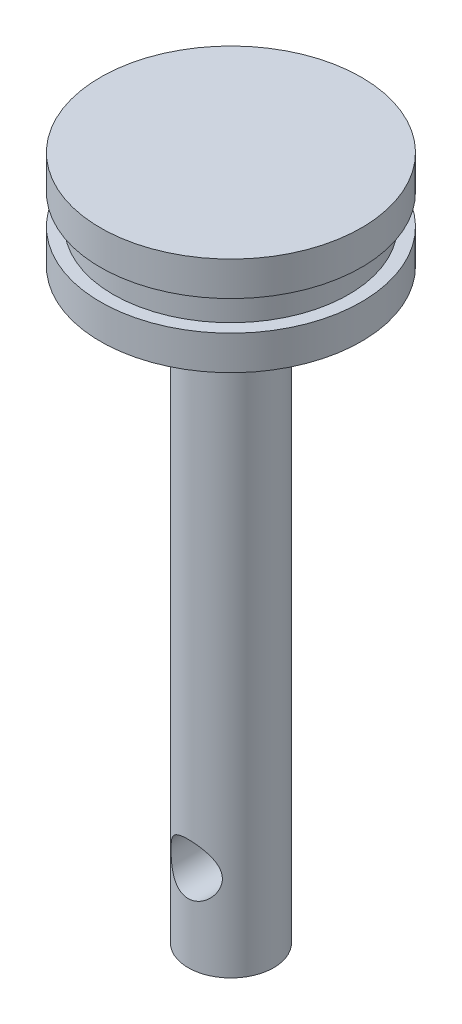
ISO-10303-21;
HEADER;
FILE_DESCRIPTION(('STEP AP214'),'2;1');
FILE_NAME('part.step','',(''),(''),'','','');
FILE_SCHEMA(('AUTOMOTIVE_DESIGN { 1 0 10303 214 1 1 1 1 }'));
ENDSEC;
DATA;
#1=APPLICATION_CONTEXT('core data for automotive mechanical design processes');
#2=APPLICATION_PROTOCOL_DEFINITION('international standard','automotive_design',2000,#1);
#3=PRODUCT_CONTEXT('',#1,'mechanical');
#4=PRODUCT('Part','Part','',(#3));
#5=PRODUCT_RELATED_PRODUCT_CATEGORY('part','',(#4));
#6=PRODUCT_DEFINITION_FORMATION('','',#4);
#7=PRODUCT_DEFINITION_CONTEXT('part definition',#1,'design');
#8=PRODUCT_DEFINITION('design','',#6,#7);
#9=PRODUCT_DEFINITION_SHAPE('','',#8);
#10=(LENGTH_UNIT() NAMED_UNIT(*) SI_UNIT(.MILLI.,.METRE.));
#11=(NAMED_UNIT(*) PLANE_ANGLE_UNIT() SI_UNIT($,.RADIAN.));
#12=(NAMED_UNIT(*) SI_UNIT($,.STERADIAN.) SOLID_ANGLE_UNIT());
#13=UNCERTAINTY_MEASURE_WITH_UNIT(LENGTH_MEASURE(1.E-05),#10,'distance_accuracy_value','');
#14=(GEOMETRIC_REPRESENTATION_CONTEXT(3) GLOBAL_UNCERTAINTY_ASSIGNED_CONTEXT((#13)) GLOBAL_UNIT_ASSIGNED_CONTEXT((#10,
#11,#12)) REPRESENTATION_CONTEXT('',''));
#15=CARTESIAN_POINT('',(0.,0.,0.));
#16=DIRECTION('',(0.,0.,1.));
#17=DIRECTION('',(1.,0.,0.));
#18=AXIS2_PLACEMENT_3D('',#15,#16,#17);
#19=CARTESIAN_POINT('',(0.,0.,0.));
#20=DIRECTION('',(0.,-1.,0.));
#21=DIRECTION('',(0.,0.,-1.));
#22=AXIS2_PLACEMENT_3D('',#19,#20,#21);
#23=CYLINDRICAL_SURFACE('',#22,5.);
#24=CARTESIAN_POINT('',(-3.,9.99999999999999,4.00000000000001));
#25=CARTESIAN_POINT('',(-2.99999990599239,9.92453838963433,3.99999997094659));
#26=CARTESIAN_POINT('',(-2.99714660074499,9.84908004817429,4.00214560778387));
#27=CARTESIAN_POINT('',(-2.98579602023829,9.69881642084412,4.0106190584126));
#28=CARTESIAN_POINT('',(-2.97729658251829,9.62401139631927,4.01694847458098));
#29=CARTESIAN_POINT('',(-2.94350195877,9.40145759919987,4.04185988554314));
#30=CARTESIAN_POINT('',(-2.90991036792576,9.25553383696135,4.06636523363868));
#31=CARTESIAN_POINT('',(-2.82286888064331,8.97380470612697,4.1272446631328));
#32=CARTESIAN_POINT('',(-2.76956233581238,8.83793459027844,4.16353284212728));
#33=CARTESIAN_POINT('',(-2.645058939393,8.57713282857403,4.24371857831164));
#34=CARTESIAN_POINT('',(-2.5738567513836,8.45220446052184,4.28761840405594));
#35=CARTESIAN_POINT('',(-2.40542341931061,8.20009868975463,4.38457211439751));
#36=CARTESIAN_POINT('',(-2.30607419983945,8.07451391925425,4.43808896832274));
#37=CARTESIAN_POINT('',(-2.08854542159202,7.84047464363108,4.54452303763809));
#38=CARTESIAN_POINT('',(-1.97035175093533,7.73203309857675,4.59743977155759));
#39=CARTESIAN_POINT('',(-1.70284578042266,7.52371753128575,4.70351798165429));
#40=CARTESIAN_POINT('',(-1.55155129309905,7.42603358635894,4.75608869625049));
#41=CARTESIAN_POINT('',(-1.31132430439156,7.30025349141202,4.82570563669469));
#42=CARTESIAN_POINT('',(-1.22900736782604,7.26177588454188,4.84737661360987));
#43=CARTESIAN_POINT('',(-1.06047221299631,7.19220903512085,4.88701002756049));
#44=CARTESIAN_POINT('',(-0.974256618946841,7.16111490828842,4.90497491519087));
#45=CARTESIAN_POINT('',(-0.806968026671432,7.1093725375467,4.9351119388654));
#46=CARTESIAN_POINT('',(-0.726184158740183,7.08801272847089,4.94767216447126));
#47=CARTESIAN_POINT('',(-0.562666348744426,7.05205003864904,4.96892323787742));
#48=CARTESIAN_POINT('',(-0.479933520527559,7.0374433923624,4.97761624192487));
#49=CARTESIAN_POINT('',(-0.313244621267389,7.0152153154839,4.99087754875312));
#50=CARTESIAN_POINT('',(-0.229289227265362,7.00759015768819,4.99544805239181));
#51=CARTESIAN_POINT('',(-0.0609397888852008,6.99943336015281,5.00033941607429));
#52=CARTESIAN_POINT('',(0.0234542099897638,6.99890099870643,5.00066070848408));
#53=CARTESIAN_POINT('',(0.255171183646362,7.00724278227974,4.99565270087357));
#54=CARTESIAN_POINT('',(0.402219957267173,7.02347114964914,4.98590479614143));
#55=CARTESIAN_POINT('',(0.69095624881843,7.07695549368241,4.95416390550291));
#56=CARTESIAN_POINT('',(0.832643369131347,7.1142130266105,4.9321700133334));
#57=CARTESIAN_POINT('',(1.10810607069192,7.20833223300195,4.87769707511975));
#58=CARTESIAN_POINT('',(1.24183096722661,7.26530642019992,4.84515792140775));
#59=CARTESIAN_POINT('',(1.49797933560354,7.39676893445169,4.77219304045846));
#60=CARTESIAN_POINT('',(1.62039986081243,7.47126181013585,4.73176526544935));
#61=CARTESIAN_POINT('',(1.86614789799246,7.64567827961851,4.64075842839173));
#62=CARTESIAN_POINT('',(1.98783715480757,7.7475766485355,4.58954363323803));
#63=CARTESIAN_POINT('',(2.2134294892317,7.96880821010486,4.48511110796775));
#64=CARTESIAN_POINT('',(2.31730807434113,8.08816499971905,4.43189074054161));
#65=CARTESIAN_POINT('',(2.51649670159326,8.35730682039774,4.32222149525339));
#66=CARTESIAN_POINT('',(2.60941864927586,8.5090151553296,4.26611322583747));
#67=CARTESIAN_POINT('',(2.76794435835452,8.82941246102666,4.16501759300692));
#68=CARTESIAN_POINT('',(2.83359844351373,8.99806943131424,4.12000980621703));
#69=CARTESIAN_POINT('',(2.92154993808436,9.30478726449562,4.05791730375361));
#70=CARTESIAN_POINT('',(2.95055806318485,9.44008126579233,4.03667777278559));
#71=CARTESIAN_POINT('',(2.98961745817055,9.71474721940126,4.00784301513238));
#72=CARTESIAN_POINT('',(2.9996907751055,9.8541142368845,4.00023192044756));
#73=CARTESIAN_POINT('',(3.00029561322378,10.1331033689616,3.9997782882838));
#74=CARTESIAN_POINT('',(2.99080006076193,10.2727255696017,4.00695621149423));
#75=CARTESIAN_POINT('',(2.95280584471633,10.5479746723138,4.03503040875294));
#76=CARTESIAN_POINT('',(2.9242921604511,10.6835983278199,4.05593752603304));
#77=CARTESIAN_POINT('',(2.84976612867928,10.9474292155495,4.10863539286051));
#78=CARTESIAN_POINT('',(2.80377564381491,11.0756454841375,4.14041253958232));
#79=CARTESIAN_POINT('',(2.69592568264802,11.3229552203075,4.21143069058874));
#80=CARTESIAN_POINT('',(2.63406022035172,11.4420452245939,4.25067450889246));
#81=CARTESIAN_POINT('',(2.48334675803862,11.6904810952463,4.34073681424694));
#82=CARTESIAN_POINT('',(2.391645038527,11.8178054323294,4.39236652981539));
#83=CARTESIAN_POINT('',(2.18975614095891,12.0565672039454,4.49643335252964));
#84=CARTESIAN_POINT('',(2.07955127457132,12.1679892460944,4.54887118822613));
#85=CARTESIAN_POINT('',(1.82651475528323,12.3864639913157,4.65671991538655));
#86=CARTESIAN_POINT('',(1.68130397020029,12.4910647057629,4.71163080343122));
#87=CARTESIAN_POINT('',(1.44944631278512,12.6281544977234,4.78599458202112));
#88=CARTESIAN_POINT('',(1.36978605711653,12.6705620021369,4.80945640676867));
#89=CARTESIAN_POINT('',(1.20623656162325,12.7483038834785,4.85305400686527));
#90=CARTESIAN_POINT('',(1.12235002598574,12.7836427131187,4.87319187464059));
#91=CARTESIAN_POINT('',(0.957140698774942,12.8444796432344,4.90820667253681));
#92=CARTESIAN_POINT('',(0.876069467337991,12.8705037184618,4.92335831278731));
#93=CARTESIAN_POINT('',(0.71146061998131,12.9156649816091,4.94982497459132));
#94=CARTESIAN_POINT('',(0.627924414708838,12.9348060288799,4.96114214594589));
#95=CARTESIAN_POINT('',(0.459119615082286,12.9659003097131,4.97959903931251));
#96=CARTESIAN_POINT('',(0.373852241304052,12.9778584373605,4.98674160560363));
#97=CARTESIAN_POINT('',(0.202384159163479,12.994406761659,4.99664216975595));
#98=CARTESIAN_POINT('',(0.116183573945423,12.9989979187889,4.99940073918633));
#99=CARTESIAN_POINT('',(-0.119519384080577,13.0013282897594,5.00079353601934));
#100=CARTESIAN_POINT('',(-0.269213134971583,12.9916010745741,4.99493619757571));
#101=CARTESIAN_POINT('',(-0.564325544477553,12.9502179458511,4.97026391444784));
#102=CARTESIAN_POINT('',(-0.709744155455477,12.9185617880599,4.95144882543497));
#103=CARTESIAN_POINT('',(-0.990283617430273,12.8355594293537,4.90298726022977));
#104=CARTESIAN_POINT('',(-1.1255320564868,12.784536560451,4.87351900635897));
#105=CARTESIAN_POINT('',(-1.38556595318151,12.6647190582365,4.80606707983651));
#106=CARTESIAN_POINT('',(-1.51034905620296,12.5959204396564,4.76808149787885));
#107=CARTESIAN_POINT('',(-1.76052652812014,12.4341500931042,4.68186861678972));
#108=CARTESIAN_POINT('',(-1.88451663454096,12.3393649364719,4.63297714592577));
#109=CARTESIAN_POINT('',(-2.11579577789689,12.1324915754345,4.5320378935883));
#110=CARTESIAN_POINT('',(-2.22306604531463,12.0203842023356,4.47998665474643));
#111=CARTESIAN_POINT('',(-2.43181699852643,11.7654389566213,4.37056449731608));
#112=CARTESIAN_POINT('',(-2.53083841179814,11.6205069155109,4.31335603990194));
#113=CARTESIAN_POINT('',(-2.70314606061125,11.3129904274047,4.20752457767503));
#114=CARTESIAN_POINT('',(-2.77644567607668,11.150415215802,4.15889711577767));
#115=CARTESIAN_POINT('',(-2.86193484914579,10.9033774473124,4.10004730463766));
#116=CARTESIAN_POINT('',(-2.88571236613332,10.8243414087028,4.08329508678221));
#117=CARTESIAN_POINT('',(-2.92679381745551,10.6638695581998,4.0539508765597));
#118=CARTESIAN_POINT('',(-2.94410184772356,10.5824353000127,4.04135625254713));
#119=CARTESIAN_POINT('',(-2.97191221271433,10.4179534493059,4.02094972226271));
#120=CARTESIAN_POINT('',(-2.98242533831513,10.3349086316283,4.01313023377049));
#121=CARTESIAN_POINT('',(-2.99646884485438,10.1679077833364,4.00265571377827));
#122=CARTESIAN_POINT('',(-3.00000010458449,10.0839518687376,4.00000003232226));
#123=CARTESIAN_POINT('',(-3.,9.99999999999999,4.00000000000001));
#124=B_SPLINE_CURVE_WITH_KNOTS('',3,(#24,#25,#26,#27,#28,#29,#30,#31,#32,#33,#34,#35,#36,#37,
#38,#39,#40,#41,#42,#43,#44,#45,#46,#47,#48,#49,#50,#51,#52,#53,#54,#55,#56,#57,#58,#59,#60,#61,
#62,#63,#64,#65,#66,#67,#68,#69,#70,#71,#72,#73,#74,#75,#76,#77,#78,#79,#80,#81,#82,#83,#84,#85,
#86,#87,#88,#89,#90,#91,#92,#93,#94,#95,#96,#97,#98,#99,#100,#101,#102,#103,#104,#105,#106,#107,
#108,#109,#110,#111,#112,#113,#114,#115,#116,#117,#118,#119,#120,#121,#122,#123),.UNSPECIFIED.,
.T.,.F.,(4,2,2,2,2,2,2,2,2,2,2,2,2,2,2,2,2,2,2,2,2,2,2,2,2,2,2,2,2,2,2,2,2,2,2,2,2,2,2,2,2,2,2,
2,2,2,2,2,2,4),(0.,0.226288173517879,0.452663065091108,0.905305714765857,1.35471981612577,
1.80426809059901,2.30878181396805,2.81367513819685,3.37309572088444,3.65297634398311,
3.93267130287329,4.18580566749444,4.43879871451846,4.69165661737851,4.94448879122709,
5.38694235003539,5.82942865693065,6.27448283989929,6.71965270654932,7.21799594026829,
7.71701907227943,8.27387316194679,8.82969494223662,9.24786570023494,9.66554925202079,
10.0838110593649,10.5024036052238,10.9204742264512,11.3387027222345,11.8323285087813,
12.3264288987103,12.884776299373,13.1641700331408,13.4433872125907,13.7024631857776,
13.9613936663243,14.2201475237758,14.4788676430947,14.9267946196281,15.3747265854331,
15.8154875864153,16.2563474905318,16.7450674536299,17.2343321574792,17.7856420979722,
18.3366648323363,18.5890061072372,18.8411873492279,19.0929671157917,19.3447151893882),.UNSPECIFIED.);
#125=CARTESIAN_POINT('',(-3.,9.99999999999999,4.00000000000001));
#126=VERTEX_POINT('',#125);
#127=EDGE_CURVE('E62',#126,#126,#124,.T.);
#128=ORIENTED_EDGE('',*,*,#127,.F.);
#129=EDGE_LOOP('',(#128));
#130=FACE_BOUND('',#129,.T.);
#131=CARTESIAN_POINT('',(0.,68.5,0.));
#132=DIRECTION('',(0.,-1.,0.));
#133=DIRECTION('',(0.,0.,-1.));
#134=AXIS2_PLACEMENT_3D('',#131,#132,#133);
#135=CIRCLE('',#134,5.);
#136=CARTESIAN_POINT('',(0.,68.5,-5.));
#137=VERTEX_POINT('',#136);
#138=EDGE_CURVE('E56',#137,#137,#135,.T.);
#139=ORIENTED_EDGE('',*,*,#138,.T.);
#140=EDGE_LOOP('',(#139));
#141=FACE_BOUND('',#140,.T.);
#142=CARTESIAN_POINT('',(0.,0.,0.));
#143=DIRECTION('',(0.,-1.,0.));
#144=DIRECTION('',(0.,0.,-1.));
#145=AXIS2_PLACEMENT_3D('',#142,#143,#144);
#146=CIRCLE('',#145,5.00000000000001);
#147=CARTESIAN_POINT('',(0.,0.,-5.00000000000001));
#148=VERTEX_POINT('',#147);
#149=EDGE_CURVE('E59',#148,#148,#146,.T.);
#150=ORIENTED_EDGE('',*,*,#149,.F.);
#151=EDGE_LOOP('',(#150));
#152=FACE_BOUND('',#151,.T.);
#153=CARTESIAN_POINT('',(3.,9.99999999999999,-4.));
#154=CARTESIAN_POINT('',(2.9999999059924,10.0754616103657,-3.99999997094658));
#155=CARTESIAN_POINT('',(2.997146600745,10.1509199518257,-4.00214560778386));
#156=CARTESIAN_POINT('',(2.98579602023829,10.3011835791559,-4.01061905841259));
#157=CARTESIAN_POINT('',(2.97729658251829,10.3759886036807,-4.01694847458097));
#158=CARTESIAN_POINT('',(2.94350195877001,10.5985424008001,-4.04185988554313));
#159=CARTESIAN_POINT('',(2.90991036792577,10.7444661630386,-4.06636523363867));
#160=CARTESIAN_POINT('',(2.82286888064332,11.026195293873,-4.1272446631328));
#161=CARTESIAN_POINT('',(2.76956233581239,11.1620654097216,-4.16353284212727));
#162=CARTESIAN_POINT('',(2.64505893939301,11.422867171426,-4.24371857831163));
#163=CARTESIAN_POINT('',(2.57385675138361,11.5477955394782,-4.28761840405594));
#164=CARTESIAN_POINT('',(2.40542341931062,11.7999013102454,-4.38457211439751));
#165=CARTESIAN_POINT('',(2.30607419983945,11.9254860807457,-4.43808896832273));
#166=CARTESIAN_POINT('',(2.08854542159203,12.1595253563689,-4.54452303763808));
#167=CARTESIAN_POINT('',(1.97035175093534,12.2679669014232,-4.59743977155759));
#168=CARTESIAN_POINT('',(1.70284578042267,12.4762824687142,-4.70351798165429));
#169=CARTESIAN_POINT('',(1.55155129309906,12.5739664136411,-4.75608869625049));
#170=CARTESIAN_POINT('',(1.31132430439157,12.699746508588,-4.82570563669469));
#171=CARTESIAN_POINT('',(1.22900736782605,12.7382241154581,-4.84737661360987));
#172=CARTESIAN_POINT('',(1.06047221299632,12.8077909648791,-4.88701002756049));
#173=CARTESIAN_POINT('',(0.974256618946848,12.8388850917116,-4.90497491519086));
#174=CARTESIAN_POINT('',(0.806968026671439,12.8906274624533,-4.9351119388654));
#175=CARTESIAN_POINT('',(0.726184158740191,12.9119872715291,-4.94767216447126));
#176=CARTESIAN_POINT('',(0.562666348744434,12.947949961351,-4.96892323787742));
#177=CARTESIAN_POINT('',(0.479933520527567,12.9625566076376,-4.97761624192487));
#178=CARTESIAN_POINT('',(0.313244621267397,12.9847846845161,-4.99087754875312));
#179=CARTESIAN_POINT('',(0.229289227265369,12.9924098423118,-4.99544805239181));
#180=CARTESIAN_POINT('',(0.0609397888852085,13.0005666398472,-5.00033941607429));
#181=CARTESIAN_POINT('',(-0.0234542099897562,13.0010990012936,-5.00066070848408));
#182=CARTESIAN_POINT('',(-0.255171183646354,12.9927572177202,-4.99565270087357));
#183=CARTESIAN_POINT('',(-0.402219957267166,12.9765288503508,-4.98590479614143));
#184=CARTESIAN_POINT('',(-0.690956248818423,12.9230445063176,-4.95416390550291));
#185=CARTESIAN_POINT('',(-0.832643369131341,12.8857869733895,-4.9321700133334));
#186=CARTESIAN_POINT('',(-1.10810607069191,12.791667766998,-4.87769707511975));
#187=CARTESIAN_POINT('',(-1.2418309672266,12.7346935798001,-4.84515792140775));
#188=CARTESIAN_POINT('',(-1.49797933560353,12.6032310655483,-4.77219304045846));
#189=CARTESIAN_POINT('',(-1.62039986081242,12.5287381898641,-4.73176526544935));
#190=CARTESIAN_POINT('',(-1.86614789799246,12.3543217203815,-4.64075842839173));
#191=CARTESIAN_POINT('',(-1.98783715480756,12.2524233514645,-4.58954363323804));
#192=CARTESIAN_POINT('',(-2.2134294892317,12.0311917898951,-4.48511110796775));
#193=CARTESIAN_POINT('',(-2.31730807434112,11.9118350002809,-4.43189074054161));
#194=CARTESIAN_POINT('',(-2.51649670159325,11.6426931796022,-4.3222214952534));
#195=CARTESIAN_POINT('',(-2.60941864927586,11.4909848446704,-4.26611322583747));
#196=CARTESIAN_POINT('',(-2.76794435835452,11.1705875389733,-4.16501759300693));
#197=CARTESIAN_POINT('',(-2.83359844351372,11.0019305686857,-4.12000980621703));
#198=CARTESIAN_POINT('',(-2.92154993808435,10.6952127355044,-4.05791730375362));
#199=CARTESIAN_POINT('',(-2.95055806318484,10.5599187342077,-4.0366777727856));
#200=CARTESIAN_POINT('',(-2.98961745817055,10.2852527805987,-4.00784301513238));
#201=CARTESIAN_POINT('',(-2.99969077510549,10.1458857631155,-4.00023192044756));
#202=CARTESIAN_POINT('',(-3.00029561322377,9.86689663103836,-3.99977828828381));
#203=CARTESIAN_POINT('',(-2.99080006076192,9.72727443039827,-4.00695621149424));
#204=CARTESIAN_POINT('',(-2.95280584471632,9.45202532768622,-4.03503040875295));
#205=CARTESIAN_POINT('',(-2.92429216045109,9.31640167218008,-4.05593752603305));
#206=CARTESIAN_POINT('',(-2.84976612867927,9.05257078445051,-4.10863539286052));
#207=CARTESIAN_POINT('',(-2.8037756438149,8.92435451586244,-4.14041253958233));
#208=CARTESIAN_POINT('',(-2.69592568264801,8.67704477969247,-4.21143069058875));
#209=CARTESIAN_POINT('',(-2.63406022035171,8.55795477540609,-4.25067450889247));
#210=CARTESIAN_POINT('',(-2.48334675803861,8.30951890475369,-4.34073681424695));
#211=CARTESIAN_POINT('',(-2.39164503852699,8.18219456767055,-4.3923665298154));
#212=CARTESIAN_POINT('',(-2.1897561409589,7.94343279605458,-4.49643335252964));
#213=CARTESIAN_POINT('',(-2.0795512745713,7.83201075390555,-4.54887118822613));
#214=CARTESIAN_POINT('',(-1.82651475528322,7.61353600868424,-4.65671991538656));
#215=CARTESIAN_POINT('',(-1.68130397020028,7.5089352942371,-4.71163080343123));
#216=CARTESIAN_POINT('',(-1.44944631278511,7.3718455022766,-4.78599458202112));
#217=CARTESIAN_POINT('',(-1.36978605711652,7.32943799786308,-4.80945640676867));
#218=CARTESIAN_POINT('',(-1.20623656162324,7.2516961165215,-4.85305400686527));
#219=CARTESIAN_POINT('',(-1.12235002598573,7.21635728688129,-4.8731918746406));
#220=CARTESIAN_POINT('',(-0.957140698774929,7.15552035676557,-4.90820667253681));
#221=CARTESIAN_POINT('',(-0.876069467337978,7.1294962815382,-4.92335831278731));
#222=CARTESIAN_POINT('',(-0.711460619981297,7.08433501839091,-4.94982497459132));
#223=CARTESIAN_POINT('',(-0.627924414708826,7.06519397112008,-4.9611421459459));
#224=CARTESIAN_POINT('',(-0.459119615082274,7.0340996902869,-4.97959903931251));
#225=CARTESIAN_POINT('',(-0.373852241304039,7.02214156263944,-4.98674160560363));
#226=CARTESIAN_POINT('',(-0.202384159163466,7.00559323834098,-4.99664216975595));
#227=CARTESIAN_POINT('',(-0.116183573945411,7.00100208121104,-4.99940073918633));
#228=CARTESIAN_POINT('',(0.119519384080588,6.99867171024059,-5.00079353601934));
#229=CARTESIAN_POINT('',(0.269213134971595,7.00839892542589,-4.99493619757571));
#230=CARTESIAN_POINT('',(0.564325544477564,7.04978205414894,-4.97026391444784));
#231=CARTESIAN_POINT('',(0.709744155455488,7.08143821194009,-4.95144882543497));
#232=CARTESIAN_POINT('',(0.990283617430284,7.16444057064628,-4.90298726022977));
#233=CARTESIAN_POINT('',(1.12553205648681,7.215463439549,-4.87351900635897));
#234=CARTESIAN_POINT('',(1.38556595318152,7.33528094176348,-4.8060670798365));
#235=CARTESIAN_POINT('',(1.51034905620297,7.40407956034356,-4.76808149787885));
#236=CARTESIAN_POINT('',(1.76052652812015,7.56584990689575,-4.68186861678972));
#237=CARTESIAN_POINT('',(1.88451663454097,7.66063506352804,-4.63297714592576));
#238=CARTESIAN_POINT('',(2.1157957778969,7.86750842456549,-4.5320378935883));
#239=CARTESIAN_POINT('',(2.22306604531464,7.97961579766439,-4.47998665474642));
#240=CARTESIAN_POINT('',(2.43181699852644,8.23456104337874,-4.37056449731608));
#241=CARTESIAN_POINT('',(2.53083841179815,8.37949308448909,-4.31335603990194));
#242=CARTESIAN_POINT('',(2.70314606061126,8.68700957259526,-4.20752457767503));
#243=CARTESIAN_POINT('',(2.77644567607669,8.84958478419803,-4.15889711577767));
#244=CARTESIAN_POINT('',(2.8619348491458,9.09662255268763,-4.10004730463765));
#245=CARTESIAN_POINT('',(2.88571236613333,9.17565859129722,-4.0832950867822));
#246=CARTESIAN_POINT('',(2.92679381745552,9.33613044180016,-4.05395087655969));
#247=CARTESIAN_POINT('',(2.94410184772357,9.41756469998732,-4.04135625254712));
#248=CARTESIAN_POINT('',(2.97191221271434,9.58204655069405,-4.0209497222627));
#249=CARTESIAN_POINT('',(2.98242533831514,9.66509136837172,-4.01313023377049));
#250=CARTESIAN_POINT('',(2.99646884485439,9.83209221666361,-4.00265571377827));
#251=CARTESIAN_POINT('',(3.00000010458449,9.9160481312624,-4.00000003232225));
#252=CARTESIAN_POINT('',(3.,9.99999999999999,-4.));
#253=B_SPLINE_CURVE_WITH_KNOTS('',3,(#153,#154,#155,#156,#157,#158,#159,#160,#161,#162,#163,
#164,#165,#166,#167,#168,#169,#170,#171,#172,#173,#174,#175,#176,#177,#178,#179,#180,#181,#182,
#183,#184,#185,#186,#187,#188,#189,#190,#191,#192,#193,#194,#195,#196,#197,#198,#199,#200,#201,
#202,#203,#204,#205,#206,#207,#208,#209,#210,#211,#212,#213,#214,#215,#216,#217,#218,#219,#220,
#221,#222,#223,#224,#225,#226,#227,#228,#229,#230,#231,#232,#233,#234,#235,#236,#237,#238,#239,
#240,#241,#242,#243,#244,#245,#246,#247,#248,#249,#250,#251,#252),.UNSPECIFIED.,.T.,.F.,(4,2,2,
2,2,2,2,2,2,2,2,2,2,2,2,2,2,2,2,2,2,2,2,2,2,2,2,2,2,2,2,2,2,2,2,2,2,2,2,2,2,2,2,2,2,2,2,2,2,4),
(0.,0.226288173517879,0.452663065091107,0.905305714765857,1.35471981612576,1.80426809059901,
2.30878181396805,2.81367513819685,3.37309572088444,3.65297634398311,3.93267130287329,
4.18580566749444,4.43879871451846,4.69165661737851,4.94448879122709,5.38694235003539,
5.82942865693065,6.27448283989929,6.71965270654932,7.21799594026829,7.71701907227943,
8.27387316194679,8.82969494223662,9.24786570023494,9.6655492520208,10.0838110593649,
10.5024036052238,10.9204742264512,11.3387027222345,11.8323285087813,12.3264288987104,
12.884776299373,13.1641700331408,13.4433872125907,13.7024631857777,13.9613936663243,
14.2201475237758,14.4788676430947,14.9267946196281,15.3747265854331,15.8154875864153,
16.2563474905318,16.7450674536299,17.2343321574792,17.7856420979722,18.3366648323363,
18.5890061072372,18.8411873492279,19.0929671157917,19.3447151893882),.UNSPECIFIED.);
#254=CARTESIAN_POINT('',(3.,9.99999999999999,-4.));
#255=VERTEX_POINT('',#254);
#256=EDGE_CURVE('E70',#255,#255,#253,.T.);
#257=ORIENTED_EDGE('',*,*,#256,.T.);
#258=EDGE_LOOP('',(#257));
#259=FACE_BOUND('',#258,.T.);
#260=ADVANCED_FACE('F30',(#130,#141,#152,#259),#23,.T.);
#261=CARTESIAN_POINT('',(5.00000000000001,0.,0.));
#262=DIRECTION('',(0.,-1.,0.));
#263=DIRECTION('',(0.,0.,-1.));
#264=AXIS2_PLACEMENT_3D('',#261,#262,#263);
#265=PLANE('',#264);
#266=ORIENTED_EDGE('',*,*,#149,.T.);
#267=EDGE_LOOP('',(#266));
#268=FACE_BOUND('',#267,.T.);
#269=ADVANCED_FACE('F32',(#268),#265,.T.);
#270=CARTESIAN_POINT('',(0.,80.,0.));
#271=DIRECTION('',(0.,1.,0.));
#272=DIRECTION('',(0.,0.,1.));
#273=AXIS2_PLACEMENT_3D('',#270,#271,#272);
#274=PLANE('',#273);
#275=CARTESIAN_POINT('',(0.,80.,0.));
#276=DIRECTION('',(0.,-1.,0.));
#277=DIRECTION('',(0.,0.,-1.));
#278=AXIS2_PLACEMENT_3D('',#275,#276,#277);
#279=CIRCLE('',#278,15.25);
#280=CARTESIAN_POINT('',(0.,80.,-15.25));
#281=VERTEX_POINT('',#280);
#282=EDGE_CURVE('E10',#281,#281,#279,.T.);
#283=ORIENTED_EDGE('',*,*,#282,.F.);
#284=EDGE_LOOP('',(#283));
#285=FACE_BOUND('',#284,.T.);
#286=ADVANCED_FACE('F108',(#285),#274,.T.);
#287=CARTESIAN_POINT('',(0.,0.,0.));
#288=DIRECTION('',(0.,-1.,0.));
#289=DIRECTION('',(0.,0.,-1.));
#290=AXIS2_PLACEMENT_3D('',#287,#288,#289);
#291=CYLINDRICAL_SURFACE('',#290,15.25);
#292=ORIENTED_EDGE('',*,*,#282,.T.);
#293=EDGE_LOOP('',(#292));
#294=FACE_BOUND('',#293,.T.);
#295=CARTESIAN_POINT('',(0.,76.,0.));
#296=DIRECTION('',(0.,-1.,0.));
#297=DIRECTION('',(0.,0.,-1.));
#298=AXIS2_PLACEMENT_3D('',#295,#296,#297);
#299=CIRCLE('',#298,15.25);
#300=CARTESIAN_POINT('',(0.,76.,-15.25));
#301=VERTEX_POINT('',#300);
#302=EDGE_CURVE('E37',#301,#301,#299,.T.);
#303=ORIENTED_EDGE('',*,*,#302,.F.);
#304=EDGE_LOOP('',(#303));
#305=FACE_BOUND('',#304,.T.);
#306=ADVANCED_FACE('F106',(#294,#305),#291,.T.);
#307=CARTESIAN_POINT('',(15.25,76.,0.));
#308=DIRECTION('',(0.,-1.,0.));
#309=DIRECTION('',(0.,0.,-1.));
#310=AXIS2_PLACEMENT_3D('',#307,#308,#309);
#311=PLANE('',#310);
#312=ORIENTED_EDGE('',*,*,#302,.T.);
#313=EDGE_LOOP('',(#312));
#314=FACE_BOUND('',#313,.T.);
#315=CARTESIAN_POINT('',(0.,76.,0.));
#316=DIRECTION('',(0.,-1.,0.));
#317=DIRECTION('',(0.,0.,-1.));
#318=AXIS2_PLACEMENT_3D('',#315,#316,#317);
#319=CIRCLE('',#318,13.75);
#320=CARTESIAN_POINT('',(0.,76.,-13.75));
#321=VERTEX_POINT('',#320);
#322=EDGE_CURVE('E41',#321,#321,#319,.T.);
#323=ORIENTED_EDGE('',*,*,#322,.F.);
#324=EDGE_LOOP('',(#323));
#325=FACE_BOUND('',#324,.T.);
#326=ADVANCED_FACE('F102',(#314,#325),#311,.T.);
#327=CARTESIAN_POINT('',(0.,0.,0.));
#328=DIRECTION('',(0.,-1.,0.));
#329=DIRECTION('',(0.,0.,-1.));
#330=AXIS2_PLACEMENT_3D('',#327,#328,#329);
#331=CYLINDRICAL_SURFACE('',#330,13.75);
#332=ORIENTED_EDGE('',*,*,#322,.T.);
#333=EDGE_LOOP('',(#332));
#334=FACE_BOUND('',#333,.T.);
#335=CARTESIAN_POINT('',(0.,72.5,0.));
#336=DIRECTION('',(0.,-1.,0.));
#337=DIRECTION('',(0.,0.,-1.));
#338=AXIS2_PLACEMENT_3D('',#335,#336,#337);
#339=CIRCLE('',#338,13.75);
#340=CARTESIAN_POINT('',(0.,72.5,-13.75));
#341=VERTEX_POINT('',#340);
#342=EDGE_CURVE('E45',#341,#341,#339,.T.);
#343=ORIENTED_EDGE('',*,*,#342,.F.);
#344=EDGE_LOOP('',(#343));
#345=FACE_BOUND('',#344,.T.);
#346=ADVANCED_FACE('F98',(#334,#345),#331,.T.);
#347=CARTESIAN_POINT('',(13.75,72.5,0.));
#348=DIRECTION('',(0.,1.,0.));
#349=DIRECTION('',(0.,0.,1.));
#350=AXIS2_PLACEMENT_3D('',#347,#348,#349);
#351=PLANE('',#350);
#352=ORIENTED_EDGE('',*,*,#342,.T.);
#353=EDGE_LOOP('',(#352));
#354=FACE_BOUND('',#353,.T.);
#355=CARTESIAN_POINT('',(0.,72.5,0.));
#356=DIRECTION('',(0.,-1.,0.));
#357=DIRECTION('',(0.,0.,-1.));
#358=AXIS2_PLACEMENT_3D('',#355,#356,#357);
#359=CIRCLE('',#358,15.25);
#360=CARTESIAN_POINT('',(0.,72.5,-15.25));
#361=VERTEX_POINT('',#360);
#362=EDGE_CURVE('E50',#361,#361,#359,.T.);
#363=ORIENTED_EDGE('',*,*,#362,.F.);
#364=EDGE_LOOP('',(#363));
#365=FACE_BOUND('',#364,.T.);
#366=ADVANCED_FACE('F94',(#354,#365),#351,.T.);
#367=CARTESIAN_POINT('',(0.,0.,0.));
#368=DIRECTION('',(0.,-1.,0.));
#369=DIRECTION('',(0.,0.,-1.));
#370=AXIS2_PLACEMENT_3D('',#367,#368,#369);
#371=CYLINDRICAL_SURFACE('',#370,15.25);
#372=ORIENTED_EDGE('',*,*,#362,.T.);
#373=EDGE_LOOP('',(#372));
#374=FACE_BOUND('',#373,.T.);
#375=CARTESIAN_POINT('',(0.,68.5,0.));
#376=DIRECTION('',(0.,-1.,0.));
#377=DIRECTION('',(0.,0.,-1.));
#378=AXIS2_PLACEMENT_3D('',#375,#376,#377);
#379=CIRCLE('',#378,15.25);
#380=CARTESIAN_POINT('',(0.,68.5,-15.25));
#381=VERTEX_POINT('',#380);
#382=EDGE_CURVE('E53',#381,#381,#379,.T.);
#383=ORIENTED_EDGE('',*,*,#382,.F.);
#384=EDGE_LOOP('',(#383));
#385=FACE_BOUND('',#384,.T.);
#386=ADVANCED_FACE('F90',(#374,#385),#371,.T.);
#387=CARTESIAN_POINT('',(15.25,68.5,0.));
#388=DIRECTION('',(0.,-1.,0.));
#389=DIRECTION('',(0.,0.,-1.));
#390=AXIS2_PLACEMENT_3D('',#387,#388,#389);
#391=PLANE('',#390);
#392=ORIENTED_EDGE('',*,*,#382,.T.);
#393=EDGE_LOOP('',(#392));
#394=FACE_BOUND('',#393,.T.);
#395=ORIENTED_EDGE('',*,*,#138,.F.);
#396=EDGE_LOOP('',(#395));
#397=FACE_BOUND('',#396,.T.);
#398=ADVANCED_FACE('F83',(#394,#397),#391,.T.);
#399=CARTESIAN_POINT('',(0.,9.99999999999999,15.251));
#400=DIRECTION('',(0.,0.,-1.));
#401=DIRECTION('',(-1.,0.,0.));
#402=AXIS2_PLACEMENT_3D('',#399,#400,#401);
#403=CYLINDRICAL_SURFACE('',#402,3.);
#404=ORIENTED_EDGE('',*,*,#127,.T.);
#405=EDGE_LOOP('',(#404));
#406=FACE_BOUND('',#405,.T.);
#407=ORIENTED_EDGE('',*,*,#256,.F.);
#408=EDGE_LOOP('',(#407));
#409=FACE_BOUND('',#408,.T.);
#410=ADVANCED_FACE('F76',(#406,#409),#403,.F.);
#411=CLOSED_SHELL('',(#260,#269,#286,#306,#326,#346,#366,#386,#398,#410));
#412=MANIFOLD_SOLID_BREP('B2',#411);
#413=ADVANCED_BREP_SHAPE_REPRESENTATION('',(#18,#412),#14);
#414=SHAPE_DEFINITION_REPRESENTATION(#9,#413);
ENDSEC;
END-ISO-10303-21;
